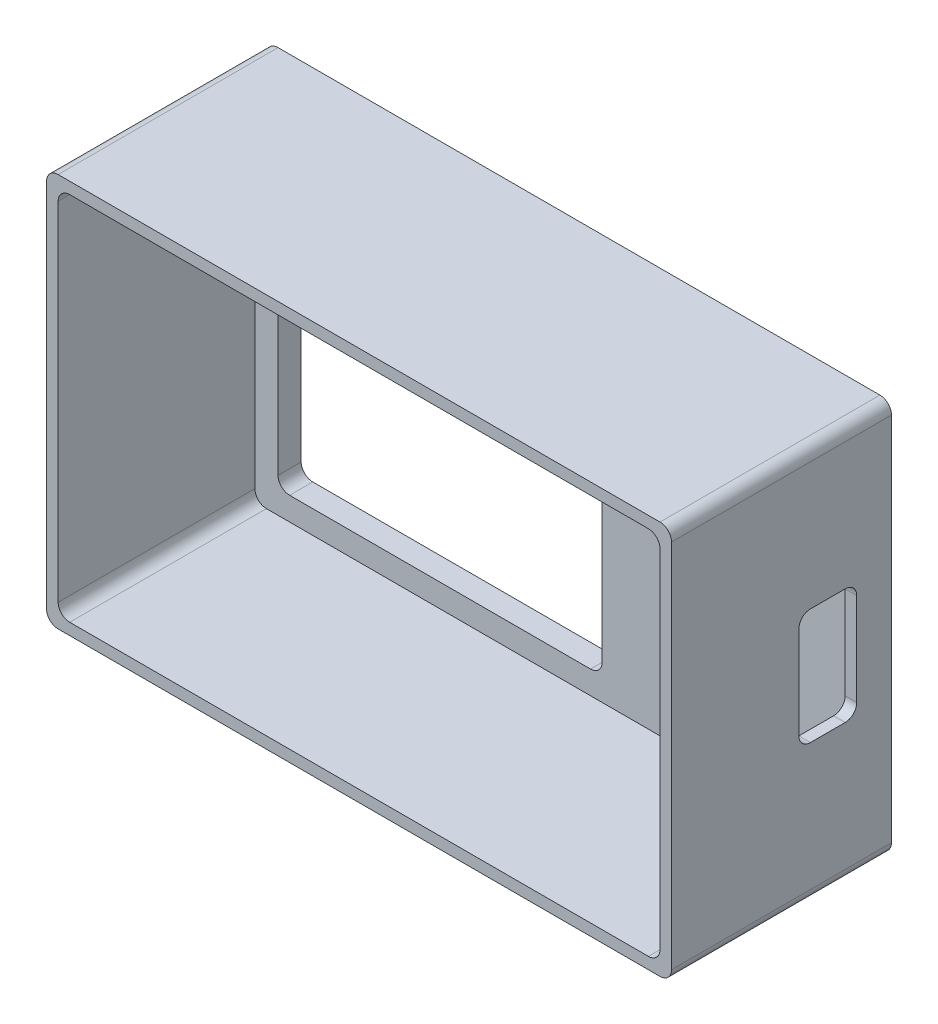
ISO-10303-21;
HEADER;
FILE_DESCRIPTION(('STEP AP214'),'2;1');
FILE_NAME('part.step','',(''),(''),'','','');
FILE_SCHEMA(('AUTOMOTIVE_DESIGN { 1 0 10303 214 1 1 1 1 }'));
ENDSEC;
DATA;
#1=APPLICATION_CONTEXT('core data for automotive mechanical design processes');
#2=APPLICATION_PROTOCOL_DEFINITION('international standard','automotive_design',2000,#1);
#3=PRODUCT_CONTEXT('',#1,'mechanical');
#4=PRODUCT('Part','Part','',(#3));
#5=PRODUCT_RELATED_PRODUCT_CATEGORY('part','',(#4));
#6=PRODUCT_DEFINITION_FORMATION('','',#4);
#7=PRODUCT_DEFINITION_CONTEXT('part definition',#1,'design');
#8=PRODUCT_DEFINITION('design','',#6,#7);
#9=PRODUCT_DEFINITION_SHAPE('','',#8);
#10=(LENGTH_UNIT() NAMED_UNIT(*) SI_UNIT(.MILLI.,.METRE.));
#11=(NAMED_UNIT(*) PLANE_ANGLE_UNIT() SI_UNIT($,.RADIAN.));
#12=(NAMED_UNIT(*) SI_UNIT($,.STERADIAN.) SOLID_ANGLE_UNIT());
#13=UNCERTAINTY_MEASURE_WITH_UNIT(LENGTH_MEASURE(1.E-05),#10,'distance_accuracy_value','');
#14=(GEOMETRIC_REPRESENTATION_CONTEXT(3) GLOBAL_UNCERTAINTY_ASSIGNED_CONTEXT((#13)) GLOBAL_UNIT_ASSIGNED_CONTEXT((#10,
#11,#12)) REPRESENTATION_CONTEXT('',''));
#15=CARTESIAN_POINT('',(0.,0.,0.));
#16=DIRECTION('',(0.,0.,1.));
#17=DIRECTION('',(1.,0.,0.));
#18=AXIS2_PLACEMENT_3D('',#15,#16,#17);
#19=CARTESIAN_POINT('',(0.,0.,2.));
#20=DIRECTION('',(0.,0.,1.));
#21=DIRECTION('',(1.,0.,0.));
#22=AXIS2_PLACEMENT_3D('',#19,#20,#21);
#23=PLANE('',#22);
#24=DIRECTION('',(-1.,0.,0.));
#25=VECTOR('',#24,1.);
#26=CARTESIAN_POINT('',(-24.,14.,2.));
#27=LINE('',#26,#25);
#28=CARTESIAN_POINT('',(2.99999999999999,14.,2.));
#29=VERTEX_POINT('',#28);
#30=CARTESIAN_POINT('',(-23.,14.,2.));
#31=VERTEX_POINT('',#30);
#32=EDGE_CURVE('E521',#29,#31,#27,.T.);
#33=ORIENTED_EDGE('',*,*,#32,.F.);
#34=CARTESIAN_POINT('',(3.,13.,2.));
#35=DIRECTION('',(0.,0.,1.));
#36=DIRECTION('',(1.,0.,0.));
#37=AXIS2_PLACEMENT_3D('',#34,#35,#36);
#38=CIRCLE('',#37,1.);
#39=CARTESIAN_POINT('',(4.,13.,2.));
#40=VERTEX_POINT('',#39);
#41=EDGE_CURVE('E493',#29,#40,#38,.F.);
#42=ORIENTED_EDGE('',*,*,#41,.T.);
#43=DIRECTION('',(0.,1.,0.));
#44=VECTOR('',#43,1.);
#45=CARTESIAN_POINT('',(4.,14.,2.));
#46=LINE('',#45,#44);
#47=CARTESIAN_POINT('',(4.,-13.,2.));
#48=VERTEX_POINT('',#47);
#49=EDGE_CURVE('E530',#48,#40,#46,.T.);
#50=ORIENTED_EDGE('',*,*,#49,.F.);
#51=CARTESIAN_POINT('',(3.,-13.,2.));
#52=DIRECTION('',(0.,0.,1.));
#53=DIRECTION('',(1.,0.,0.));
#54=AXIS2_PLACEMENT_3D('',#51,#52,#53);
#55=CIRCLE('',#54,1.);
#56=CARTESIAN_POINT('',(3.,-14.,2.));
#57=VERTEX_POINT('',#56);
#58=EDGE_CURVE('E488',#48,#57,#55,.F.);
#59=ORIENTED_EDGE('',*,*,#58,.T.);
#60=DIRECTION('',(1.,0.,0.));
#61=VECTOR('',#60,1.);
#62=CARTESIAN_POINT('',(-24.,-14.,2.));
#63=LINE('',#62,#61);
#64=CARTESIAN_POINT('',(-23.,-14.,2.));
#65=VERTEX_POINT('',#64);
#66=EDGE_CURVE('E535',#65,#57,#63,.T.);
#67=ORIENTED_EDGE('',*,*,#66,.F.);
#68=CARTESIAN_POINT('',(-23.,-13.,2.));
#69=DIRECTION('',(0.,0.,1.));
#70=DIRECTION('',(1.,0.,0.));
#71=AXIS2_PLACEMENT_3D('',#68,#69,#70);
#72=CIRCLE('',#71,1.);
#73=CARTESIAN_POINT('',(-24.,-13.,2.));
#74=VERTEX_POINT('',#73);
#75=EDGE_CURVE('E61',#65,#74,#72,.F.);
#76=ORIENTED_EDGE('',*,*,#75,.T.);
#77=DIRECTION('',(0.,-1.,0.));
#78=VECTOR('',#77,1.);
#79=CARTESIAN_POINT('',(-24.,14.,2.));
#80=LINE('',#79,#78);
#81=CARTESIAN_POINT('',(-24.,13.,2.));
#82=VERTEX_POINT('',#81);
#83=EDGE_CURVE('E523',#82,#74,#80,.T.);
#84=ORIENTED_EDGE('',*,*,#83,.F.);
#85=CARTESIAN_POINT('',(-23.,13.,2.));
#86=DIRECTION('',(0.,0.,1.));
#87=DIRECTION('',(1.,0.,0.));
#88=AXIS2_PLACEMENT_3D('',#85,#86,#87);
#89=CIRCLE('',#88,1.);
#90=EDGE_CURVE('E11',#82,#31,#89,.F.);
#91=ORIENTED_EDGE('',*,*,#90,.T.);
#92=EDGE_LOOP('',(#33,#42,#50,#59,#67,#76,#84,#91));
#93=FACE_BOUND('',#92,.T.);
#94=DIRECTION('',(0.,-1.,0.));
#95=VECTOR('',#94,1.);
#96=CARTESIAN_POINT('',(-26.,16.,2.));
#97=LINE('',#96,#95);
#98=CARTESIAN_POINT('',(-26.,15.,2.));
#99=VERTEX_POINT('',#98);
#100=CARTESIAN_POINT('',(-26.,-15.,2.));
#101=VERTEX_POINT('',#100);
#102=EDGE_CURVE('E265',#99,#101,#97,.T.);
#103=ORIENTED_EDGE('',*,*,#102,.T.);
#104=CARTESIAN_POINT('',(-25.,-15.,2.));
#105=DIRECTION('',(0.,0.,1.));
#106=DIRECTION('',(1.,0.,0.));
#107=AXIS2_PLACEMENT_3D('',#104,#105,#106);
#108=CIRCLE('',#107,1.);
#109=CARTESIAN_POINT('',(-25.,-16.,2.));
#110=VERTEX_POINT('',#109);
#111=EDGE_CURVE('E269',#101,#110,#108,.T.);
#112=ORIENTED_EDGE('',*,*,#111,.T.);
#113=DIRECTION('',(1.,0.,0.));
#114=VECTOR('',#113,1.);
#115=CARTESIAN_POINT('',(-26.,-16.,2.));
#116=LINE('',#115,#114);
#117=CARTESIAN_POINT('',(25.,-16.,2.));
#118=VERTEX_POINT('',#117);
#119=EDGE_CURVE('E284',#110,#118,#116,.T.);
#120=ORIENTED_EDGE('',*,*,#119,.T.);
#121=CARTESIAN_POINT('',(25.,-15.,2.));
#122=DIRECTION('',(0.,0.,1.));
#123=DIRECTION('',(1.,0.,0.));
#124=AXIS2_PLACEMENT_3D('',#121,#122,#123);
#125=CIRCLE('',#124,1.);
#126=CARTESIAN_POINT('',(26.,-15.,2.));
#127=VERTEX_POINT('',#126);
#128=EDGE_CURVE('E271',#118,#127,#125,.T.);
#129=ORIENTED_EDGE('',*,*,#128,.T.);
#130=DIRECTION('',(0.,1.,0.));
#131=VECTOR('',#130,1.);
#132=CARTESIAN_POINT('',(26.,16.,2.));
#133=LINE('',#132,#131);
#134=CARTESIAN_POINT('',(26.,15.,2.));
#135=VERTEX_POINT('',#134);
#136=EDGE_CURVE('E604',#127,#135,#133,.T.);
#137=ORIENTED_EDGE('',*,*,#136,.T.);
#138=CARTESIAN_POINT('',(25.,15.,2.));
#139=DIRECTION('',(0.,0.,1.));
#140=DIRECTION('',(1.,0.,0.));
#141=AXIS2_PLACEMENT_3D('',#138,#139,#140);
#142=CIRCLE('',#141,1.);
#143=CARTESIAN_POINT('',(25.,16.,2.));
#144=VERTEX_POINT('',#143);
#145=EDGE_CURVE('E294',#135,#144,#142,.T.);
#146=ORIENTED_EDGE('',*,*,#145,.T.);
#147=DIRECTION('',(-1.,0.,0.));
#148=VECTOR('',#147,1.);
#149=CARTESIAN_POINT('',(-26.,16.,2.));
#150=LINE('',#149,#148);
#151=CARTESIAN_POINT('',(-25.,16.,2.));
#152=VERTEX_POINT('',#151);
#153=EDGE_CURVE('E262',#144,#152,#150,.T.);
#154=ORIENTED_EDGE('',*,*,#153,.T.);
#155=CARTESIAN_POINT('',(-25.,15.,2.));
#156=DIRECTION('',(0.,0.,1.));
#157=DIRECTION('',(1.,0.,0.));
#158=AXIS2_PLACEMENT_3D('',#155,#156,#157);
#159=CIRCLE('',#158,1.);
#160=EDGE_CURVE('E257',#152,#99,#159,.T.);
#161=ORIENTED_EDGE('',*,*,#160,.T.);
#162=EDGE_LOOP('',(#103,#112,#120,#129,#137,#146,#154,#161));
#163=FACE_BOUND('',#162,.T.);
#164=ADVANCED_FACE('F47',(#93,#163),#23,.T.);
#165=CARTESIAN_POINT('',(0.,0.,0.));
#166=DIRECTION('',(0.,0.,1.));
#167=DIRECTION('',(1.,0.,0.));
#168=AXIS2_PLACEMENT_3D('',#165,#166,#167);
#169=PLANE('',#168);
#170=DIRECTION('',(0.,-1.,0.));
#171=VECTOR('',#170,1.);
#172=CARTESIAN_POINT('',(-27.,17.,0.));
#173=LINE('',#172,#171);
#174=CARTESIAN_POINT('',(-27.,16.,0.));
#175=VERTEX_POINT('',#174);
#176=CARTESIAN_POINT('',(-27.,-16.,0.));
#177=VERTEX_POINT('',#176);
#178=EDGE_CURVE('E297',#175,#177,#173,.T.);
#179=ORIENTED_EDGE('',*,*,#178,.F.);
#180=CARTESIAN_POINT('',(-26.,16.,0.));
#181=DIRECTION('',(0.,0.,1.));
#182=DIRECTION('',(1.,0.,0.));
#183=AXIS2_PLACEMENT_3D('',#180,#181,#182);
#184=CIRCLE('',#183,1.);
#185=CARTESIAN_POINT('',(-26.,17.,0.));
#186=VERTEX_POINT('',#185);
#187=EDGE_CURVE('E355',#175,#186,#184,.F.);
#188=ORIENTED_EDGE('',*,*,#187,.T.);
#189=DIRECTION('',(-1.,0.,0.));
#190=VECTOR('',#189,1.);
#191=CARTESIAN_POINT('',(-27.,17.,0.));
#192=LINE('',#191,#190);
#193=CARTESIAN_POINT('',(26.,17.,0.));
#194=VERTEX_POINT('',#193);
#195=EDGE_CURVE('E553',#194,#186,#192,.T.);
#196=ORIENTED_EDGE('',*,*,#195,.F.);
#197=CARTESIAN_POINT('',(26.,16.,0.));
#198=DIRECTION('',(0.,0.,1.));
#199=DIRECTION('',(1.,0.,0.));
#200=AXIS2_PLACEMENT_3D('',#197,#198,#199);
#201=CIRCLE('',#200,1.);
#202=CARTESIAN_POINT('',(27.,16.,0.));
#203=VERTEX_POINT('',#202);
#204=EDGE_CURVE('E342',#194,#203,#201,.F.);
#205=ORIENTED_EDGE('',*,*,#204,.T.);
#206=DIRECTION('',(0.,1.,0.));
#207=VECTOR('',#206,1.);
#208=CARTESIAN_POINT('',(27.,17.,0.));
#209=LINE('',#208,#207);
#210=CARTESIAN_POINT('',(27.,-16.,0.));
#211=VERTEX_POINT('',#210);
#212=EDGE_CURVE('E545',#211,#203,#209,.T.);
#213=ORIENTED_EDGE('',*,*,#212,.F.);
#214=CARTESIAN_POINT('',(26.,-16.,0.));
#215=DIRECTION('',(0.,0.,1.));
#216=DIRECTION('',(1.,0.,0.));
#217=AXIS2_PLACEMENT_3D('',#214,#215,#216);
#218=CIRCLE('',#217,1.);
#219=CARTESIAN_POINT('',(26.,-17.,0.));
#220=VERTEX_POINT('',#219);
#221=EDGE_CURVE('E346',#211,#220,#218,.F.);
#222=ORIENTED_EDGE('',*,*,#221,.T.);
#223=DIRECTION('',(1.,0.,0.));
#224=VECTOR('',#223,1.);
#225=CARTESIAN_POINT('',(-27.,-17.,0.));
#226=LINE('',#225,#224);
#227=CARTESIAN_POINT('',(-26.,-17.,0.));
#228=VERTEX_POINT('',#227);
#229=EDGE_CURVE('E290',#228,#220,#226,.T.);
#230=ORIENTED_EDGE('',*,*,#229,.F.);
#231=CARTESIAN_POINT('',(-26.,-16.,0.));
#232=DIRECTION('',(0.,0.,1.));
#233=DIRECTION('',(1.,0.,0.));
#234=AXIS2_PLACEMENT_3D('',#231,#232,#233);
#235=CIRCLE('',#234,1.);
#236=EDGE_CURVE('E353',#228,#177,#235,.F.);
#237=ORIENTED_EDGE('',*,*,#236,.T.);
#238=EDGE_LOOP('',(#179,#188,#196,#205,#213,#222,#230,#237));
#239=FACE_BOUND('',#238,.T.);
#240=DIRECTION('',(1.,0.,0.));
#241=VECTOR('',#240,1.);
#242=CARTESIAN_POINT('',(-24.,-14.,0.));
#243=LINE('',#242,#241);
#244=CARTESIAN_POINT('',(-23.,-14.,0.));
#245=VERTEX_POINT('',#244);
#246=CARTESIAN_POINT('',(3.,-14.,0.));
#247=VERTEX_POINT('',#246);
#248=EDGE_CURVE('E519',#245,#247,#243,.T.);
#249=ORIENTED_EDGE('',*,*,#248,.T.);
#250=CARTESIAN_POINT('',(3.,-13.,0.));
#251=DIRECTION('',(0.,0.,1.));
#252=DIRECTION('',(1.,0.,0.));
#253=AXIS2_PLACEMENT_3D('',#250,#251,#252);
#254=CIRCLE('',#253,1.);
#255=CARTESIAN_POINT('',(4.,-13.,0.));
#256=VERTEX_POINT('',#255);
#257=EDGE_CURVE('E484',#247,#256,#254,.T.);
#258=ORIENTED_EDGE('',*,*,#257,.T.);
#259=DIRECTION('',(0.,1.,0.));
#260=VECTOR('',#259,1.);
#261=CARTESIAN_POINT('',(4.,14.,0.));
#262=LINE('',#261,#260);
#263=CARTESIAN_POINT('',(4.,13.,0.));
#264=VERTEX_POINT('',#263);
#265=EDGE_CURVE('E543',#256,#264,#262,.T.);
#266=ORIENTED_EDGE('',*,*,#265,.T.);
#267=CARTESIAN_POINT('',(3.,13.,0.));
#268=DIRECTION('',(0.,0.,1.));
#269=DIRECTION('',(1.,0.,0.));
#270=AXIS2_PLACEMENT_3D('',#267,#268,#269);
#271=CIRCLE('',#270,1.);
#272=CARTESIAN_POINT('',(2.99999999999999,14.,0.));
#273=VERTEX_POINT('',#272);
#274=EDGE_CURVE('E491',#264,#273,#271,.T.);
#275=ORIENTED_EDGE('',*,*,#274,.T.);
#276=DIRECTION('',(-1.,0.,0.));
#277=VECTOR('',#276,1.);
#278=CARTESIAN_POINT('',(-24.,14.,0.));
#279=LINE('',#278,#277);
#280=CARTESIAN_POINT('',(-23.,14.,0.));
#281=VERTEX_POINT('',#280);
#282=EDGE_CURVE('E512',#273,#281,#279,.T.);
#283=ORIENTED_EDGE('',*,*,#282,.T.);
#284=CARTESIAN_POINT('',(-23.,13.,0.));
#285=DIRECTION('',(0.,0.,1.));
#286=DIRECTION('',(1.,0.,0.));
#287=AXIS2_PLACEMENT_3D('',#284,#285,#286);
#288=CIRCLE('',#287,1.);
#289=CARTESIAN_POINT('',(-24.,13.,0.));
#290=VERTEX_POINT('',#289);
#291=EDGE_CURVE('E59',#281,#290,#288,.T.);
#292=ORIENTED_EDGE('',*,*,#291,.T.);
#293=DIRECTION('',(0.,-1.,0.));
#294=VECTOR('',#293,1.);
#295=CARTESIAN_POINT('',(-24.,14.,0.));
#296=LINE('',#295,#294);
#297=CARTESIAN_POINT('',(-24.,-13.,0.));
#298=VERTEX_POINT('',#297);
#299=EDGE_CURVE('E508',#290,#298,#296,.T.);
#300=ORIENTED_EDGE('',*,*,#299,.T.);
#301=CARTESIAN_POINT('',(-23.,-13.,0.));
#302=DIRECTION('',(0.,0.,1.));
#303=DIRECTION('',(1.,0.,0.));
#304=AXIS2_PLACEMENT_3D('',#301,#302,#303);
#305=CIRCLE('',#304,1.);
#306=EDGE_CURVE('E500',#298,#245,#305,.T.);
#307=ORIENTED_EDGE('',*,*,#306,.T.);
#308=EDGE_LOOP('',(#249,#258,#266,#275,#283,#292,#300,#307));
#309=FACE_BOUND('',#308,.T.);
#310=ADVANCED_FACE('F510',(#239,#309),#169,.F.);
#311=CARTESIAN_POINT('',(27.,17.,2.));
#312=DIRECTION('',(-1.,0.,0.));
#313=DIRECTION('',(0.,0.,1.));
#314=AXIS2_PLACEMENT_3D('',#311,#312,#313);
#315=PLANE('',#314);
#316=DIRECTION('',(0.,0.,1.));
#317=VECTOR('',#316,1.);
#318=CARTESIAN_POINT('',(27.,5.,8.));
#319=LINE('',#318,#317);
#320=CARTESIAN_POINT('',(27.,5.,4.));
#321=VERTEX_POINT('',#320);
#322=CARTESIAN_POINT('',(27.,5.,7.));
#323=VERTEX_POINT('',#322);
#324=EDGE_CURVE('E630',#321,#323,#319,.T.);
#325=ORIENTED_EDGE('',*,*,#324,.F.);
#326=CARTESIAN_POINT('',(27.,4.,4.));
#327=DIRECTION('',(-1.,0.,0.));
#328=DIRECTION('',(0.,0.,1.));
#329=AXIS2_PLACEMENT_3D('',#326,#327,#328);
#330=CIRCLE('',#329,1.);
#331=CARTESIAN_POINT('',(27.,4.,3.));
#332=VERTEX_POINT('',#331);
#333=EDGE_CURVE('E432',#321,#332,#330,.T.);
#334=ORIENTED_EDGE('',*,*,#333,.T.);
#335=DIRECTION('',(0.,1.,0.));
#336=VECTOR('',#335,1.);
#337=CARTESIAN_POINT('',(27.,5.,3.));
#338=LINE('',#337,#336);
#339=CARTESIAN_POINT('',(27.,-4.,3.));
#340=VERTEX_POINT('',#339);
#341=EDGE_CURVE('E631',#340,#332,#338,.T.);
#342=ORIENTED_EDGE('',*,*,#341,.F.);
#343=CARTESIAN_POINT('',(27.,-4.,4.));
#344=DIRECTION('',(-1.,0.,0.));
#345=DIRECTION('',(0.,0.,1.));
#346=AXIS2_PLACEMENT_3D('',#343,#344,#345);
#347=CIRCLE('',#346,1.);
#348=CARTESIAN_POINT('',(27.,-5.,4.));
#349=VERTEX_POINT('',#348);
#350=EDGE_CURVE('E451',#340,#349,#347,.T.);
#351=ORIENTED_EDGE('',*,*,#350,.T.);
#352=DIRECTION('',(0.,0.,-1.));
#353=VECTOR('',#352,1.);
#354=CARTESIAN_POINT('',(27.,-5.,8.));
#355=LINE('',#354,#353);
#356=CARTESIAN_POINT('',(27.,-5.,7.));
#357=VERTEX_POINT('',#356);
#358=EDGE_CURVE('E606',#357,#349,#355,.T.);
#359=ORIENTED_EDGE('',*,*,#358,.F.);
#360=CARTESIAN_POINT('',(27.,-4.,7.));
#361=DIRECTION('',(-1.,0.,0.));
#362=DIRECTION('',(0.,0.,1.));
#363=AXIS2_PLACEMENT_3D('',#360,#361,#362);
#364=CIRCLE('',#363,1.);
#365=CARTESIAN_POINT('',(27.,-4.,8.));
#366=VERTEX_POINT('',#365);
#367=EDGE_CURVE('E448',#357,#366,#364,.T.);
#368=ORIENTED_EDGE('',*,*,#367,.T.);
#369=DIRECTION('',(0.,-1.,0.));
#370=VECTOR('',#369,1.);
#371=CARTESIAN_POINT('',(27.,5.,8.));
#372=LINE('',#371,#370);
#373=CARTESIAN_POINT('',(27.,4.,8.));
#374=VERTEX_POINT('',#373);
#375=EDGE_CURVE('E623',#374,#366,#372,.T.);
#376=ORIENTED_EDGE('',*,*,#375,.F.);
#377=CARTESIAN_POINT('',(27.,4.,7.));
#378=DIRECTION('',(-1.,0.,0.));
#379=DIRECTION('',(0.,0.,1.));
#380=AXIS2_PLACEMENT_3D('',#377,#378,#379);
#381=CIRCLE('',#380,1.);
#382=EDGE_CURVE('E439',#374,#323,#381,.T.);
#383=ORIENTED_EDGE('',*,*,#382,.T.);
#384=EDGE_LOOP('',(#325,#334,#342,#351,#359,#368,#376,#383));
#385=FACE_BOUND('',#384,.T.);
#386=DIRECTION('',(0.,1.,0.));
#387=VECTOR('',#386,1.);
#388=CARTESIAN_POINT('',(27.,17.,19.));
#389=LINE('',#388,#387);
#390=CARTESIAN_POINT('',(27.,-16.,19.));
#391=VERTEX_POINT('',#390);
#392=CARTESIAN_POINT('',(27.,16.,19.));
#393=VERTEX_POINT('',#392);
#394=EDGE_CURVE('E592',#391,#393,#389,.T.);
#395=ORIENTED_EDGE('',*,*,#394,.F.);
#396=DIRECTION('',(0.,0.,-1.));
#397=VECTOR('',#396,1.);
#398=CARTESIAN_POINT('',(27.,-16.,2.));
#399=LINE('',#398,#397);
#400=EDGE_CURVE('E387',#391,#211,#399,.T.);
#401=ORIENTED_EDGE('',*,*,#400,.T.);
#402=ORIENTED_EDGE('',*,*,#212,.T.);
#403=DIRECTION('',(0.,0.,-1.));
#404=VECTOR('',#403,1.);
#405=CARTESIAN_POINT('',(27.,16.,2.));
#406=LINE('',#405,#404);
#407=EDGE_CURVE('E382',#203,#393,#406,.F.);
#408=ORIENTED_EDGE('',*,*,#407,.T.);
#409=EDGE_LOOP('',(#395,#401,#402,#408));
#410=FACE_BOUND('',#409,.T.);
#411=ADVANCED_FACE('F677',(#385,#410),#315,.F.);
#412=CARTESIAN_POINT('',(-27.,17.,2.));
#413=DIRECTION('',(0.,-1.,0.));
#414=DIRECTION('',(0.,0.,-1.));
#415=AXIS2_PLACEMENT_3D('',#412,#413,#414);
#416=PLANE('',#415);
#417=ORIENTED_EDGE('',*,*,#195,.T.);
#418=DIRECTION('',(0.,0.,-1.));
#419=VECTOR('',#418,1.);
#420=CARTESIAN_POINT('',(-26.,17.,2.));
#421=LINE('',#420,#419);
#422=CARTESIAN_POINT('',(-26.,17.,19.));
#423=VERTEX_POINT('',#422);
#424=EDGE_CURVE('E363',#186,#423,#421,.F.);
#425=ORIENTED_EDGE('',*,*,#424,.T.);
#426=DIRECTION('',(-1.,0.,0.));
#427=VECTOR('',#426,1.);
#428=CARTESIAN_POINT('',(-27.,17.,19.));
#429=LINE('',#428,#427);
#430=CARTESIAN_POINT('',(26.,17.,19.));
#431=VERTEX_POINT('',#430);
#432=EDGE_CURVE('E589',#431,#423,#429,.T.);
#433=ORIENTED_EDGE('',*,*,#432,.F.);
#434=DIRECTION('',(0.,0.,-1.));
#435=VECTOR('',#434,1.);
#436=CARTESIAN_POINT('',(26.,17.,2.));
#437=LINE('',#436,#435);
#438=EDGE_CURVE('E356',#431,#194,#437,.T.);
#439=ORIENTED_EDGE('',*,*,#438,.T.);
#440=EDGE_LOOP('',(#417,#425,#433,#439));
#441=FACE_BOUND('',#440,.T.);
#442=ADVANCED_FACE('F679',(#441),#416,.F.);
#443=CARTESIAN_POINT('',(-27.,17.,2.));
#444=DIRECTION('',(1.,0.,0.));
#445=DIRECTION('',(0.,1.,0.));
#446=AXIS2_PLACEMENT_3D('',#443,#444,#445);
#447=PLANE('',#446);
#448=DIRECTION('',(0.,-1.,0.));
#449=VECTOR('',#448,1.);
#450=CARTESIAN_POINT('',(-27.,17.,19.));
#451=LINE('',#450,#449);
#452=CARTESIAN_POINT('',(-27.,16.,19.));
#453=VERTEX_POINT('',#452);
#454=CARTESIAN_POINT('',(-27.,-16.,19.));
#455=VERTEX_POINT('',#454);
#456=EDGE_CURVE('E583',#453,#455,#451,.T.);
#457=ORIENTED_EDGE('',*,*,#456,.F.);
#458=DIRECTION('',(0.,0.,-1.));
#459=VECTOR('',#458,1.);
#460=CARTESIAN_POINT('',(-27.,16.,2.));
#461=LINE('',#460,#459);
#462=EDGE_CURVE('E344',#453,#175,#461,.T.);
#463=ORIENTED_EDGE('',*,*,#462,.T.);
#464=ORIENTED_EDGE('',*,*,#178,.T.);
#465=DIRECTION('',(0.,0.,-1.));
#466=VECTOR('',#465,1.);
#467=CARTESIAN_POINT('',(-27.,-16.,2.));
#468=LINE('',#467,#466);
#469=EDGE_CURVE('E337',#177,#455,#468,.F.);
#470=ORIENTED_EDGE('',*,*,#469,.T.);
#471=EDGE_LOOP('',(#457,#463,#464,#470));
#472=FACE_BOUND('',#471,.T.);
#473=ADVANCED_FACE('F567',(#472),#447,.F.);
#474=CARTESIAN_POINT('',(-27.,-17.,2.));
#475=DIRECTION('',(0.,1.,0.));
#476=DIRECTION('',(0.,0.,1.));
#477=AXIS2_PLACEMENT_3D('',#474,#475,#476);
#478=PLANE('',#477);
#479=DIRECTION('',(1.,0.,0.));
#480=VECTOR('',#479,1.);
#481=CARTESIAN_POINT('',(-27.,-17.,19.));
#482=LINE('',#481,#480);
#483=CARTESIAN_POINT('',(-26.,-17.,19.));
#484=VERTEX_POINT('',#483);
#485=CARTESIAN_POINT('',(26.,-17.,19.));
#486=VERTEX_POINT('',#485);
#487=EDGE_CURVE('E550',#484,#486,#482,.T.);
#488=ORIENTED_EDGE('',*,*,#487,.F.);
#489=DIRECTION('',(0.,0.,-1.));
#490=VECTOR('',#489,1.);
#491=CARTESIAN_POINT('',(-26.,-17.,2.));
#492=LINE('',#491,#490);
#493=EDGE_CURVE('E377',#484,#228,#492,.T.);
#494=ORIENTED_EDGE('',*,*,#493,.T.);
#495=ORIENTED_EDGE('',*,*,#229,.T.);
#496=DIRECTION('',(0.,0.,-1.));
#497=VECTOR('',#496,1.);
#498=CARTESIAN_POINT('',(26.,-17.,2.));
#499=LINE('',#498,#497);
#500=EDGE_CURVE('E376',#220,#486,#499,.F.);
#501=ORIENTED_EDGE('',*,*,#500,.T.);
#502=EDGE_LOOP('',(#488,#494,#495,#501));
#503=FACE_BOUND('',#502,.T.);
#504=ADVANCED_FACE('F581',(#503),#478,.F.);
#505=CARTESIAN_POINT('',(4.,14.,2.));
#506=DIRECTION('',(-1.,0.,0.));
#507=DIRECTION('',(0.,-1.,0.));
#508=AXIS2_PLACEMENT_3D('',#505,#506,#507);
#509=PLANE('',#508);
#510=ORIENTED_EDGE('',*,*,#265,.F.);
#511=DIRECTION('',(0.,0.,-1.));
#512=VECTOR('',#511,1.);
#513=CARTESIAN_POINT('',(4.,-13.,2.));
#514=LINE('',#513,#512);
#515=EDGE_CURVE('E468',#256,#48,#514,.F.);
#516=ORIENTED_EDGE('',*,*,#515,.T.);
#517=ORIENTED_EDGE('',*,*,#49,.T.);
#518=DIRECTION('',(0.,0.,-1.));
#519=VECTOR('',#518,1.);
#520=CARTESIAN_POINT('',(4.,13.,0.));
#521=LINE('',#520,#519);
#522=EDGE_CURVE('E461',#40,#264,#521,.T.);
#523=ORIENTED_EDGE('',*,*,#522,.T.);
#524=EDGE_LOOP('',(#510,#516,#517,#523));
#525=FACE_BOUND('',#524,.T.);
#526=ADVANCED_FACE('F713',(#525),#509,.T.);
#527=CARTESIAN_POINT('',(-24.,14.,2.));
#528=DIRECTION('',(0.,-1.,0.));
#529=DIRECTION('',(0.,0.,-1.));
#530=AXIS2_PLACEMENT_3D('',#527,#528,#529);
#531=PLANE('',#530);
#532=ORIENTED_EDGE('',*,*,#282,.F.);
#533=DIRECTION('',(0.,0.,-1.));
#534=VECTOR('',#533,1.);
#535=CARTESIAN_POINT('',(3.,14.,2.));
#536=LINE('',#535,#534);
#537=EDGE_CURVE('E478',#273,#29,#536,.F.);
#538=ORIENTED_EDGE('',*,*,#537,.T.);
#539=ORIENTED_EDGE('',*,*,#32,.T.);
#540=DIRECTION('',(0.,0.,-1.));
#541=VECTOR('',#540,1.);
#542=CARTESIAN_POINT('',(-23.,14.,0.));
#543=LINE('',#542,#541);
#544=EDGE_CURVE('E472',#31,#281,#543,.T.);
#545=ORIENTED_EDGE('',*,*,#544,.T.);
#546=EDGE_LOOP('',(#532,#538,#539,#545));
#547=FACE_BOUND('',#546,.T.);
#548=ADVANCED_FACE('F528',(#547),#531,.T.);
#549=CARTESIAN_POINT('',(-24.,14.,2.));
#550=DIRECTION('',(1.,0.,0.));
#551=DIRECTION('',(0.,0.,-1.));
#552=AXIS2_PLACEMENT_3D('',#549,#550,#551);
#553=PLANE('',#552);
#554=ORIENTED_EDGE('',*,*,#83,.T.);
#555=DIRECTION('',(0.,0.,-1.));
#556=VECTOR('',#555,1.);
#557=CARTESIAN_POINT('',(-24.,-13.,0.));
#558=LINE('',#557,#556);
#559=EDGE_CURVE('E481',#74,#298,#558,.T.);
#560=ORIENTED_EDGE('',*,*,#559,.T.);
#561=ORIENTED_EDGE('',*,*,#299,.F.);
#562=DIRECTION('',(0.,0.,-1.));
#563=VECTOR('',#562,1.);
#564=CARTESIAN_POINT('',(-24.,13.,2.));
#565=LINE('',#564,#563);
#566=EDGE_CURVE('E75',#290,#82,#565,.F.);
#567=ORIENTED_EDGE('',*,*,#566,.T.);
#568=EDGE_LOOP('',(#554,#560,#561,#567));
#569=FACE_BOUND('',#568,.T.);
#570=ADVANCED_FACE('F514',(#569),#553,.T.);
#571=CARTESIAN_POINT('',(-24.,-14.,2.));
#572=DIRECTION('',(0.,1.,0.));
#573=DIRECTION('',(0.,0.,1.));
#574=AXIS2_PLACEMENT_3D('',#571,#572,#573);
#575=PLANE('',#574);
#576=ORIENTED_EDGE('',*,*,#66,.T.);
#577=DIRECTION('',(0.,0.,-1.));
#578=VECTOR('',#577,1.);
#579=CARTESIAN_POINT('',(3.,-14.,0.));
#580=LINE('',#579,#578);
#581=EDGE_CURVE('E463',#57,#247,#580,.T.);
#582=ORIENTED_EDGE('',*,*,#581,.T.);
#583=ORIENTED_EDGE('',*,*,#248,.F.);
#584=DIRECTION('',(0.,0.,-1.));
#585=VECTOR('',#584,1.);
#586=CARTESIAN_POINT('',(-23.,-14.,2.));
#587=LINE('',#586,#585);
#588=EDGE_CURVE('E456',#245,#65,#587,.F.);
#589=ORIENTED_EDGE('',*,*,#588,.T.);
#590=EDGE_LOOP('',(#576,#582,#583,#589));
#591=FACE_BOUND('',#590,.T.);
#592=ADVANCED_FACE('F752',(#591),#575,.T.);
#593=CARTESIAN_POINT('',(0.,0.,19.));
#594=DIRECTION('',(0.,0.,1.));
#595=DIRECTION('',(1.,0.,0.));
#596=AXIS2_PLACEMENT_3D('',#593,#594,#595);
#597=PLANE('',#596);
#598=ORIENTED_EDGE('',*,*,#432,.T.);
#599=CARTESIAN_POINT('',(-26.,16.,19.));
#600=DIRECTION('',(0.,0.,1.));
#601=DIRECTION('',(1.,0.,0.));
#602=AXIS2_PLACEMENT_3D('',#599,#600,#601);
#603=CIRCLE('',#602,1.);
#604=EDGE_CURVE('E373',#423,#453,#603,.T.);
#605=ORIENTED_EDGE('',*,*,#604,.T.);
#606=ORIENTED_EDGE('',*,*,#456,.T.);
#607=CARTESIAN_POINT('',(-26.,-16.,19.));
#608=DIRECTION('',(0.,0.,1.));
#609=DIRECTION('',(1.,0.,0.));
#610=AXIS2_PLACEMENT_3D('',#607,#608,#609);
#611=CIRCLE('',#610,1.);
#612=EDGE_CURVE('E367',#455,#484,#611,.T.);
#613=ORIENTED_EDGE('',*,*,#612,.T.);
#614=ORIENTED_EDGE('',*,*,#487,.T.);
#615=CARTESIAN_POINT('',(26.,-16.,19.));
#616=DIRECTION('',(0.,0.,1.));
#617=DIRECTION('',(1.,0.,0.));
#618=AXIS2_PLACEMENT_3D('',#615,#616,#617);
#619=CIRCLE('',#618,1.);
#620=EDGE_CURVE('E370',#486,#391,#619,.T.);
#621=ORIENTED_EDGE('',*,*,#620,.T.);
#622=ORIENTED_EDGE('',*,*,#394,.T.);
#623=CARTESIAN_POINT('',(26.,16.,19.));
#624=DIRECTION('',(0.,0.,1.));
#625=DIRECTION('',(1.,0.,0.));
#626=AXIS2_PLACEMENT_3D('',#623,#624,#625);
#627=CIRCLE('',#626,1.);
#628=EDGE_CURVE('E365',#393,#431,#627,.T.);
#629=ORIENTED_EDGE('',*,*,#628,.T.);
#630=EDGE_LOOP('',(#598,#605,#606,#613,#614,#621,#622,#629));
#631=FACE_BOUND('',#630,.T.);
#632=DIRECTION('',(-1.,0.,0.));
#633=VECTOR('',#632,1.);
#634=CARTESIAN_POINT('',(-26.,16.,19.));
#635=LINE('',#634,#633);
#636=CARTESIAN_POINT('',(25.,16.,19.));
#637=VERTEX_POINT('',#636);
#638=CARTESIAN_POINT('',(-25.,16.,19.));
#639=VERTEX_POINT('',#638);
#640=EDGE_CURVE('E611',#637,#639,#635,.T.);
#641=ORIENTED_EDGE('',*,*,#640,.F.);
#642=CARTESIAN_POINT('',(25.,15.,19.));
#643=DIRECTION('',(0.,0.,1.));
#644=DIRECTION('',(1.,0.,0.));
#645=AXIS2_PLACEMENT_3D('',#642,#643,#644);
#646=CIRCLE('',#645,1.);
#647=CARTESIAN_POINT('',(26.,15.,19.));
#648=VERTEX_POINT('',#647);
#649=EDGE_CURVE('E333',#637,#648,#646,.F.);
#650=ORIENTED_EDGE('',*,*,#649,.T.);
#651=DIRECTION('',(0.,1.,0.));
#652=VECTOR('',#651,1.);
#653=CARTESIAN_POINT('',(26.,16.,19.));
#654=LINE('',#653,#652);
#655=CARTESIAN_POINT('',(26.,-15.,19.));
#656=VERTEX_POINT('',#655);
#657=EDGE_CURVE('E601',#656,#648,#654,.T.);
#658=ORIENTED_EDGE('',*,*,#657,.F.);
#659=CARTESIAN_POINT('',(25.,-15.,19.));
#660=DIRECTION('',(0.,0.,1.));
#661=DIRECTION('',(1.,0.,0.));
#662=AXIS2_PLACEMENT_3D('',#659,#660,#661);
#663=CIRCLE('',#662,1.);
#664=CARTESIAN_POINT('',(25.,-16.,19.));
#665=VERTEX_POINT('',#664);
#666=EDGE_CURVE('E335',#656,#665,#663,.F.);
#667=ORIENTED_EDGE('',*,*,#666,.T.);
#668=DIRECTION('',(1.,0.,0.));
#669=VECTOR('',#668,1.);
#670=CARTESIAN_POINT('',(-26.,-16.,19.));
#671=LINE('',#670,#669);
#672=CARTESIAN_POINT('',(-25.,-16.,19.));
#673=VERTEX_POINT('',#672);
#674=EDGE_CURVE('E598',#673,#665,#671,.T.);
#675=ORIENTED_EDGE('',*,*,#674,.F.);
#676=CARTESIAN_POINT('',(-25.,-15.,19.));
#677=DIRECTION('',(0.,0.,1.));
#678=DIRECTION('',(1.,0.,0.));
#679=AXIS2_PLACEMENT_3D('',#676,#677,#678);
#680=CIRCLE('',#679,1.);
#681=CARTESIAN_POINT('',(-26.,-15.,19.));
#682=VERTEX_POINT('',#681);
#683=EDGE_CURVE('E330',#673,#682,#680,.F.);
#684=ORIENTED_EDGE('',*,*,#683,.T.);
#685=DIRECTION('',(0.,-1.,0.));
#686=VECTOR('',#685,1.);
#687=CARTESIAN_POINT('',(-26.,16.,19.));
#688=LINE('',#687,#686);
#689=CARTESIAN_POINT('',(-26.,15.,19.));
#690=VERTEX_POINT('',#689);
#691=EDGE_CURVE('E612',#690,#682,#688,.T.);
#692=ORIENTED_EDGE('',*,*,#691,.F.);
#693=CARTESIAN_POINT('',(-25.,15.,19.));
#694=DIRECTION('',(0.,0.,1.));
#695=DIRECTION('',(1.,0.,0.));
#696=AXIS2_PLACEMENT_3D('',#693,#694,#695);
#697=CIRCLE('',#696,1.);
#698=EDGE_CURVE('E289',#690,#639,#697,.F.);
#699=ORIENTED_EDGE('',*,*,#698,.T.);
#700=EDGE_LOOP('',(#641,#650,#658,#667,#675,#684,#692,#699));
#701=FACE_BOUND('',#700,.T.);
#702=ADVANCED_FACE('F580',(#631,#701),#597,.T.);
#703=CARTESIAN_POINT('',(26.,16.,19.));
#704=DIRECTION('',(-1.,0.,0.));
#705=DIRECTION('',(0.,-1.,0.));
#706=AXIS2_PLACEMENT_3D('',#703,#704,#705);
#707=PLANE('',#706);
#708=DIRECTION('',(0.,-1.,0.));
#709=VECTOR('',#708,1.);
#710=CARTESIAN_POINT('',(26.,16.,3.00000000000001));
#711=LINE('',#710,#709);
#712=CARTESIAN_POINT('',(26.,4.,3.));
#713=VERTEX_POINT('',#712);
#714=CARTESIAN_POINT('',(26.,-4.,3.));
#715=VERTEX_POINT('',#714);
#716=EDGE_CURVE('E405',#713,#715,#711,.T.);
#717=ORIENTED_EDGE('',*,*,#716,.F.);
#718=CARTESIAN_POINT('',(26.,4.,4.));
#719=DIRECTION('',(-1.,0.,0.));
#720=DIRECTION('',(0.,-1.,0.));
#721=AXIS2_PLACEMENT_3D('',#718,#719,#720);
#722=CIRCLE('',#721,1.);
#723=CARTESIAN_POINT('',(26.,5.,4.));
#724=VERTEX_POINT('',#723);
#725=EDGE_CURVE('E440',#713,#724,#722,.F.);
#726=ORIENTED_EDGE('',*,*,#725,.T.);
#727=DIRECTION('',(0.,0.,-1.));
#728=VECTOR('',#727,1.);
#729=CARTESIAN_POINT('',(26.,5.,19.));
#730=LINE('',#729,#728);
#731=CARTESIAN_POINT('',(26.,5.,7.));
#732=VERTEX_POINT('',#731);
#733=EDGE_CURVE('E388',#732,#724,#730,.T.);
#734=ORIENTED_EDGE('',*,*,#733,.F.);
#735=CARTESIAN_POINT('',(26.,4.,7.));
#736=DIRECTION('',(-1.,0.,0.));
#737=DIRECTION('',(0.,-1.,0.));
#738=AXIS2_PLACEMENT_3D('',#735,#736,#737);
#739=CIRCLE('',#738,1.);
#740=CARTESIAN_POINT('',(26.,4.,8.));
#741=VERTEX_POINT('',#740);
#742=EDGE_CURVE('E444',#732,#741,#739,.F.);
#743=ORIENTED_EDGE('',*,*,#742,.T.);
#744=DIRECTION('',(0.,1.,0.));
#745=VECTOR('',#744,1.);
#746=CARTESIAN_POINT('',(26.,16.,8.00000000000001));
#747=LINE('',#746,#745);
#748=CARTESIAN_POINT('',(26.,-4.,8.));
#749=VERTEX_POINT('',#748);
#750=EDGE_CURVE('E395',#749,#741,#747,.T.);
#751=ORIENTED_EDGE('',*,*,#750,.F.);
#752=CARTESIAN_POINT('',(26.,-4.,7.));
#753=DIRECTION('',(-1.,0.,0.));
#754=DIRECTION('',(0.,-1.,0.));
#755=AXIS2_PLACEMENT_3D('',#752,#753,#754);
#756=CIRCLE('',#755,1.);
#757=CARTESIAN_POINT('',(26.,-5.,7.));
#758=VERTEX_POINT('',#757);
#759=EDGE_CURVE('E450',#749,#758,#756,.F.);
#760=ORIENTED_EDGE('',*,*,#759,.T.);
#761=DIRECTION('',(0.,0.,1.));
#762=VECTOR('',#761,1.);
#763=CARTESIAN_POINT('',(26.,-5.,19.));
#764=LINE('',#763,#762);
#765=CARTESIAN_POINT('',(26.,-5.,4.));
#766=VERTEX_POINT('',#765);
#767=EDGE_CURVE('E400',#766,#758,#764,.T.);
#768=ORIENTED_EDGE('',*,*,#767,.F.);
#769=CARTESIAN_POINT('',(26.,-4.,4.));
#770=DIRECTION('',(-1.,0.,0.));
#771=DIRECTION('',(0.,-1.,0.));
#772=AXIS2_PLACEMENT_3D('',#769,#770,#771);
#773=CIRCLE('',#772,1.);
#774=EDGE_CURVE('E452',#766,#715,#773,.F.);
#775=ORIENTED_EDGE('',*,*,#774,.T.);
#776=EDGE_LOOP('',(#717,#726,#734,#743,#751,#760,#768,#775));
#777=FACE_BOUND('',#776,.T.);
#778=ORIENTED_EDGE('',*,*,#136,.F.);
#779=DIRECTION('',(0.,0.,-1.));
#780=VECTOR('',#779,1.);
#781=CARTESIAN_POINT('',(26.,-15.,19.));
#782=LINE('',#781,#780);
#783=EDGE_CURVE('E322',#127,#656,#782,.F.);
#784=ORIENTED_EDGE('',*,*,#783,.T.);
#785=ORIENTED_EDGE('',*,*,#657,.T.);
#786=DIRECTION('',(0.,0.,-1.));
#787=VECTOR('',#786,1.);
#788=CARTESIAN_POINT('',(26.,15.,2.));
#789=LINE('',#788,#787);
#790=EDGE_CURVE('E321',#648,#135,#789,.T.);
#791=ORIENTED_EDGE('',*,*,#790,.T.);
#792=EDGE_LOOP('',(#778,#784,#785,#791));
#793=FACE_BOUND('',#792,.T.);
#794=ADVANCED_FACE('F647',(#777,#793),#707,.T.);
#795=CARTESIAN_POINT('',(-26.,16.,19.));
#796=DIRECTION('',(0.,-1.,0.));
#797=DIRECTION('',(0.,0.,-1.));
#798=AXIS2_PLACEMENT_3D('',#795,#796,#797);
#799=PLANE('',#798);
#800=ORIENTED_EDGE('',*,*,#640,.T.);
#801=DIRECTION('',(0.,0.,-1.));
#802=VECTOR('',#801,1.);
#803=CARTESIAN_POINT('',(-25.,16.,2.));
#804=LINE('',#803,#802);
#805=EDGE_CURVE('E318',#639,#152,#804,.T.);
#806=ORIENTED_EDGE('',*,*,#805,.T.);
#807=ORIENTED_EDGE('',*,*,#153,.F.);
#808=DIRECTION('',(0.,0.,-1.));
#809=VECTOR('',#808,1.);
#810=CARTESIAN_POINT('',(25.,16.,19.));
#811=LINE('',#810,#809);
#812=EDGE_CURVE('E312',#144,#637,#811,.F.);
#813=ORIENTED_EDGE('',*,*,#812,.T.);
#814=EDGE_LOOP('',(#800,#806,#807,#813));
#815=FACE_BOUND('',#814,.T.);
#816=ADVANCED_FACE('F742',(#815),#799,.T.);
#817=CARTESIAN_POINT('',(-26.,16.,19.));
#818=DIRECTION('',(1.,0.,0.));
#819=DIRECTION('',(0.,1.,0.));
#820=AXIS2_PLACEMENT_3D('',#817,#818,#819);
#821=PLANE('',#820);
#822=ORIENTED_EDGE('',*,*,#691,.T.);
#823=DIRECTION('',(0.,0.,-1.));
#824=VECTOR('',#823,1.);
#825=CARTESIAN_POINT('',(-26.,-15.,2.));
#826=LINE('',#825,#824);
#827=EDGE_CURVE('E278',#682,#101,#826,.T.);
#828=ORIENTED_EDGE('',*,*,#827,.T.);
#829=ORIENTED_EDGE('',*,*,#102,.F.);
#830=DIRECTION('',(0.,0.,-1.));
#831=VECTOR('',#830,1.);
#832=CARTESIAN_POINT('',(-26.,15.,19.));
#833=LINE('',#832,#831);
#834=EDGE_CURVE('E280',#99,#690,#833,.F.);
#835=ORIENTED_EDGE('',*,*,#834,.T.);
#836=EDGE_LOOP('',(#822,#828,#829,#835));
#837=FACE_BOUND('',#836,.T.);
#838=ADVANCED_FACE('F277',(#837),#821,.T.);
#839=CARTESIAN_POINT('',(-26.,-16.,19.));
#840=DIRECTION('',(0.,1.,0.));
#841=DIRECTION('',(0.,0.,1.));
#842=AXIS2_PLACEMENT_3D('',#839,#840,#841);
#843=PLANE('',#842);
#844=ORIENTED_EDGE('',*,*,#119,.F.);
#845=DIRECTION('',(0.,0.,-1.));
#846=VECTOR('',#845,1.);
#847=CARTESIAN_POINT('',(-25.,-16.,19.));
#848=LINE('',#847,#846);
#849=EDGE_CURVE('E315',#110,#673,#848,.F.);
#850=ORIENTED_EDGE('',*,*,#849,.T.);
#851=ORIENTED_EDGE('',*,*,#674,.T.);
#852=DIRECTION('',(0.,0.,-1.));
#853=VECTOR('',#852,1.);
#854=CARTESIAN_POINT('',(25.,-16.,2.));
#855=LINE('',#854,#853);
#856=EDGE_CURVE('E306',#665,#118,#855,.T.);
#857=ORIENTED_EDGE('',*,*,#856,.T.);
#858=EDGE_LOOP('',(#844,#850,#851,#857));
#859=FACE_BOUND('',#858,.T.);
#860=ADVANCED_FACE('F729',(#859),#843,.T.);
#861=CARTESIAN_POINT('',(-25.,-15.,19.));
#862=DIRECTION('',(0.,0.,1.));
#863=DIRECTION('',(1.,0.,0.));
#864=AXIS2_PLACEMENT_3D('',#861,#862,#863);
#865=CYLINDRICAL_SURFACE('',#864,1.);
#866=ORIENTED_EDGE('',*,*,#683,.F.);
#867=ORIENTED_EDGE('',*,*,#849,.F.);
#868=ORIENTED_EDGE('',*,*,#111,.F.);
#869=ORIENTED_EDGE('',*,*,#827,.F.);
#870=EDGE_LOOP('',(#866,#867,#868,#869));
#871=FACE_BOUND('',#870,.T.);
#872=ADVANCED_FACE('F722',(#871),#865,.F.);
#873=CARTESIAN_POINT('',(-25.,15.,19.));
#874=DIRECTION('',(0.,0.,1.));
#875=DIRECTION('',(1.,0.,0.));
#876=AXIS2_PLACEMENT_3D('',#873,#874,#875);
#877=CYLINDRICAL_SURFACE('',#876,1.);
#878=ORIENTED_EDGE('',*,*,#698,.F.);
#879=ORIENTED_EDGE('',*,*,#834,.F.);
#880=ORIENTED_EDGE('',*,*,#160,.F.);
#881=ORIENTED_EDGE('',*,*,#805,.F.);
#882=EDGE_LOOP('',(#878,#879,#880,#881));
#883=FACE_BOUND('',#882,.T.);
#884=ADVANCED_FACE('F281',(#883),#877,.F.);
#885=CARTESIAN_POINT('',(25.,-15.,19.));
#886=DIRECTION('',(0.,0.,1.));
#887=DIRECTION('',(1.,0.,0.));
#888=AXIS2_PLACEMENT_3D('',#885,#886,#887);
#889=CYLINDRICAL_SURFACE('',#888,1.);
#890=ORIENTED_EDGE('',*,*,#666,.F.);
#891=ORIENTED_EDGE('',*,*,#783,.F.);
#892=ORIENTED_EDGE('',*,*,#128,.F.);
#893=ORIENTED_EDGE('',*,*,#856,.F.);
#894=EDGE_LOOP('',(#890,#891,#892,#893));
#895=FACE_BOUND('',#894,.T.);
#896=ADVANCED_FACE('F704',(#895),#889,.F.);
#897=CARTESIAN_POINT('',(25.,15.,19.));
#898=DIRECTION('',(0.,0.,1.));
#899=DIRECTION('',(1.,0.,0.));
#900=AXIS2_PLACEMENT_3D('',#897,#898,#899);
#901=CYLINDRICAL_SURFACE('',#900,1.);
#902=ORIENTED_EDGE('',*,*,#649,.F.);
#903=ORIENTED_EDGE('',*,*,#812,.F.);
#904=ORIENTED_EDGE('',*,*,#145,.F.);
#905=ORIENTED_EDGE('',*,*,#790,.F.);
#906=EDGE_LOOP('',(#902,#903,#904,#905));
#907=FACE_BOUND('',#906,.T.);
#908=ADVANCED_FACE('F699',(#907),#901,.F.);
#909=CARTESIAN_POINT('',(-26.,16.,2.));
#910=DIRECTION('',(0.,0.,-1.));
#911=DIRECTION('',(-1.,0.,0.));
#912=AXIS2_PLACEMENT_3D('',#909,#910,#911);
#913=CYLINDRICAL_SURFACE('',#912,1.);
#914=ORIENTED_EDGE('',*,*,#604,.F.);
#915=ORIENTED_EDGE('',*,*,#424,.F.);
#916=ORIENTED_EDGE('',*,*,#187,.F.);
#917=ORIENTED_EDGE('',*,*,#462,.F.);
#918=EDGE_LOOP('',(#914,#915,#916,#917));
#919=FACE_BOUND('',#918,.T.);
#920=ADVANCED_FACE('F700',(#919),#913,.T.);
#921=CARTESIAN_POINT('',(-26.,-16.,2.));
#922=DIRECTION('',(0.,0.,-1.));
#923=DIRECTION('',(-1.,0.,0.));
#924=AXIS2_PLACEMENT_3D('',#921,#922,#923);
#925=CYLINDRICAL_SURFACE('',#924,1.);
#926=ORIENTED_EDGE('',*,*,#612,.F.);
#927=ORIENTED_EDGE('',*,*,#469,.F.);
#928=ORIENTED_EDGE('',*,*,#236,.F.);
#929=ORIENTED_EDGE('',*,*,#493,.F.);
#930=EDGE_LOOP('',(#926,#927,#928,#929));
#931=FACE_BOUND('',#930,.T.);
#932=ADVANCED_FACE('F574',(#931),#925,.T.);
#933=CARTESIAN_POINT('',(26.,-16.,2.));
#934=DIRECTION('',(0.,0.,-1.));
#935=DIRECTION('',(-1.,0.,0.));
#936=AXIS2_PLACEMENT_3D('',#933,#934,#935);
#937=CYLINDRICAL_SURFACE('',#936,1.);
#938=ORIENTED_EDGE('',*,*,#620,.F.);
#939=ORIENTED_EDGE('',*,*,#500,.F.);
#940=ORIENTED_EDGE('',*,*,#221,.F.);
#941=ORIENTED_EDGE('',*,*,#400,.F.);
#942=EDGE_LOOP('',(#938,#939,#940,#941));
#943=FACE_BOUND('',#942,.T.);
#944=ADVANCED_FACE('F686',(#943),#937,.T.);
#945=CARTESIAN_POINT('',(26.,16.,2.));
#946=DIRECTION('',(0.,0.,-1.));
#947=DIRECTION('',(-1.,0.,0.));
#948=AXIS2_PLACEMENT_3D('',#945,#946,#947);
#949=CYLINDRICAL_SURFACE('',#948,1.);
#950=ORIENTED_EDGE('',*,*,#628,.F.);
#951=ORIENTED_EDGE('',*,*,#407,.F.);
#952=ORIENTED_EDGE('',*,*,#204,.F.);
#953=ORIENTED_EDGE('',*,*,#438,.F.);
#954=EDGE_LOOP('',(#950,#951,#952,#953));
#955=FACE_BOUND('',#954,.T.);
#956=ADVANCED_FACE('F687',(#955),#949,.T.);
#957=CARTESIAN_POINT('',(10.,5.,3.));
#958=DIRECTION('',(0.,0.,-1.));
#959=DIRECTION('',(0.,1.,0.));
#960=AXIS2_PLACEMENT_3D('',#957,#958,#959);
#961=PLANE('',#960);
#962=ORIENTED_EDGE('',*,*,#341,.T.);
#963=DIRECTION('',(1.,0.,0.));
#964=VECTOR('',#963,1.);
#965=CARTESIAN_POINT('',(26.,4.,3.));
#966=LINE('',#965,#964);
#967=EDGE_CURVE('E417',#332,#713,#966,.F.);
#968=ORIENTED_EDGE('',*,*,#967,.T.);
#969=ORIENTED_EDGE('',*,*,#716,.T.);
#970=DIRECTION('',(1.,0.,0.));
#971=VECTOR('',#970,1.);
#972=CARTESIAN_POINT('',(27.,-4.,3.));
#973=LINE('',#972,#971);
#974=EDGE_CURVE('E415',#715,#340,#973,.T.);
#975=ORIENTED_EDGE('',*,*,#974,.T.);
#976=EDGE_LOOP('',(#962,#968,#969,#975));
#977=FACE_BOUND('',#976,.T.);
#978=ADVANCED_FACE('F640',(#977),#961,.F.);
#979=CARTESIAN_POINT('',(10.,-5.,8.));
#980=DIRECTION('',(0.,-1.,0.));
#981=DIRECTION('',(0.,0.,-1.));
#982=AXIS2_PLACEMENT_3D('',#979,#980,#981);
#983=PLANE('',#982);
#984=ORIENTED_EDGE('',*,*,#767,.T.);
#985=DIRECTION('',(1.,0.,0.));
#986=VECTOR('',#985,1.);
#987=CARTESIAN_POINT('',(27.,-5.,7.));
#988=LINE('',#987,#986);
#989=EDGE_CURVE('E429',#758,#357,#988,.T.);
#990=ORIENTED_EDGE('',*,*,#989,.T.);
#991=ORIENTED_EDGE('',*,*,#358,.T.);
#992=DIRECTION('',(1.,0.,0.));
#993=VECTOR('',#992,1.);
#994=CARTESIAN_POINT('',(26.,-5.,4.));
#995=LINE('',#994,#993);
#996=EDGE_CURVE('E430',#349,#766,#995,.F.);
#997=ORIENTED_EDGE('',*,*,#996,.T.);
#998=EDGE_LOOP('',(#984,#990,#991,#997));
#999=FACE_BOUND('',#998,.T.);
#1000=ADVANCED_FACE('F674',(#999),#983,.F.);
#1001=CARTESIAN_POINT('',(10.,5.,8.));
#1002=DIRECTION('',(0.,0.,1.));
#1003=DIRECTION('',(0.,-1.,0.));
#1004=AXIS2_PLACEMENT_3D('',#1001,#1002,#1003);
#1005=PLANE('',#1004);
#1006=ORIENTED_EDGE('',*,*,#750,.T.);
#1007=DIRECTION('',(1.,0.,0.));
#1008=VECTOR('',#1007,1.);
#1009=CARTESIAN_POINT('',(27.,4.,8.));
#1010=LINE('',#1009,#1008);
#1011=EDGE_CURVE('E421',#741,#374,#1010,.T.);
#1012=ORIENTED_EDGE('',*,*,#1011,.T.);
#1013=ORIENTED_EDGE('',*,*,#375,.T.);
#1014=DIRECTION('',(1.,0.,0.));
#1015=VECTOR('',#1014,1.);
#1016=CARTESIAN_POINT('',(26.,-4.,8.));
#1017=LINE('',#1016,#1015);
#1018=EDGE_CURVE('E419',#366,#749,#1017,.F.);
#1019=ORIENTED_EDGE('',*,*,#1018,.T.);
#1020=EDGE_LOOP('',(#1006,#1012,#1013,#1019));
#1021=FACE_BOUND('',#1020,.T.);
#1022=ADVANCED_FACE('F665',(#1021),#1005,.F.);
#1023=CARTESIAN_POINT('',(10.,5.,8.));
#1024=DIRECTION('',(0.,1.,0.));
#1025=DIRECTION('',(0.,0.,1.));
#1026=AXIS2_PLACEMENT_3D('',#1023,#1024,#1025);
#1027=PLANE('',#1026);
#1028=ORIENTED_EDGE('',*,*,#733,.T.);
#1029=DIRECTION('',(1.,0.,0.));
#1030=VECTOR('',#1029,1.);
#1031=CARTESIAN_POINT('',(27.,5.,4.));
#1032=LINE('',#1031,#1030);
#1033=EDGE_CURVE('E410',#724,#321,#1032,.T.);
#1034=ORIENTED_EDGE('',*,*,#1033,.T.);
#1035=ORIENTED_EDGE('',*,*,#324,.T.);
#1036=DIRECTION('',(1.,0.,0.));
#1037=VECTOR('',#1036,1.);
#1038=CARTESIAN_POINT('',(26.,5.,7.));
#1039=LINE('',#1038,#1037);
#1040=EDGE_CURVE('E408',#323,#732,#1039,.F.);
#1041=ORIENTED_EDGE('',*,*,#1040,.T.);
#1042=EDGE_LOOP('',(#1028,#1034,#1035,#1041));
#1043=FACE_BOUND('',#1042,.T.);
#1044=ADVANCED_FACE('F653',(#1043),#1027,.F.);
#1045=CARTESIAN_POINT('',(10.,4.,4.));
#1046=DIRECTION('',(-1.,0.,0.));
#1047=DIRECTION('',(0.,0.,1.));
#1048=AXIS2_PLACEMENT_3D('',#1045,#1046,#1047);
#1049=CYLINDRICAL_SURFACE('',#1048,1.);
#1050=ORIENTED_EDGE('',*,*,#725,.F.);
#1051=ORIENTED_EDGE('',*,*,#967,.F.);
#1052=ORIENTED_EDGE('',*,*,#333,.F.);
#1053=ORIENTED_EDGE('',*,*,#1033,.F.);
#1054=EDGE_LOOP('',(#1050,#1051,#1052,#1053));
#1055=FACE_BOUND('',#1054,.T.);
#1056=ADVANCED_FACE('F642',(#1055),#1049,.F.);
#1057=CARTESIAN_POINT('',(10.,4.,7.));
#1058=DIRECTION('',(-1.,0.,0.));
#1059=DIRECTION('',(0.,0.,1.));
#1060=AXIS2_PLACEMENT_3D('',#1057,#1058,#1059);
#1061=CYLINDRICAL_SURFACE('',#1060,1.);
#1062=ORIENTED_EDGE('',*,*,#742,.F.);
#1063=ORIENTED_EDGE('',*,*,#1040,.F.);
#1064=ORIENTED_EDGE('',*,*,#382,.F.);
#1065=ORIENTED_EDGE('',*,*,#1011,.F.);
#1066=EDGE_LOOP('',(#1062,#1063,#1064,#1065));
#1067=FACE_BOUND('',#1066,.T.);
#1068=ADVANCED_FACE('F660',(#1067),#1061,.F.);
#1069=CARTESIAN_POINT('',(10.,-4.,7.));
#1070=DIRECTION('',(-1.,0.,0.));
#1071=DIRECTION('',(0.,0.,1.));
#1072=AXIS2_PLACEMENT_3D('',#1069,#1070,#1071);
#1073=CYLINDRICAL_SURFACE('',#1072,1.);
#1074=ORIENTED_EDGE('',*,*,#759,.F.);
#1075=ORIENTED_EDGE('',*,*,#1018,.F.);
#1076=ORIENTED_EDGE('',*,*,#367,.F.);
#1077=ORIENTED_EDGE('',*,*,#989,.F.);
#1078=EDGE_LOOP('',(#1074,#1075,#1076,#1077));
#1079=FACE_BOUND('',#1078,.T.);
#1080=ADVANCED_FACE('F668',(#1079),#1073,.F.);
#1081=CARTESIAN_POINT('',(10.,-4.,4.));
#1082=DIRECTION('',(-1.,0.,0.));
#1083=DIRECTION('',(0.,0.,1.));
#1084=AXIS2_PLACEMENT_3D('',#1081,#1082,#1083);
#1085=CYLINDRICAL_SURFACE('',#1084,1.);
#1086=ORIENTED_EDGE('',*,*,#774,.F.);
#1087=ORIENTED_EDGE('',*,*,#996,.F.);
#1088=ORIENTED_EDGE('',*,*,#350,.F.);
#1089=ORIENTED_EDGE('',*,*,#974,.F.);
#1090=EDGE_LOOP('',(#1086,#1087,#1088,#1089));
#1091=FACE_BOUND('',#1090,.T.);
#1092=ADVANCED_FACE('F672',(#1091),#1085,.F.);
#1093=CARTESIAN_POINT('',(3.,-13.,2.));
#1094=DIRECTION('',(0.,0.,1.));
#1095=DIRECTION('',(1.,0.,0.));
#1096=AXIS2_PLACEMENT_3D('',#1093,#1094,#1095);
#1097=CYLINDRICAL_SURFACE('',#1096,1.);
#1098=ORIENTED_EDGE('',*,*,#58,.F.);
#1099=ORIENTED_EDGE('',*,*,#515,.F.);
#1100=ORIENTED_EDGE('',*,*,#257,.F.);
#1101=ORIENTED_EDGE('',*,*,#581,.F.);
#1102=EDGE_LOOP('',(#1098,#1099,#1100,#1101));
#1103=FACE_BOUND('',#1102,.T.);
#1104=ADVANCED_FACE('F771',(#1103),#1097,.F.);
#1105=CARTESIAN_POINT('',(3.,13.,2.));
#1106=DIRECTION('',(0.,0.,1.));
#1107=DIRECTION('',(1.,0.,0.));
#1108=AXIS2_PLACEMENT_3D('',#1105,#1106,#1107);
#1109=CYLINDRICAL_SURFACE('',#1108,1.);
#1110=ORIENTED_EDGE('',*,*,#41,.F.);
#1111=ORIENTED_EDGE('',*,*,#537,.F.);
#1112=ORIENTED_EDGE('',*,*,#274,.F.);
#1113=ORIENTED_EDGE('',*,*,#522,.F.);
#1114=EDGE_LOOP('',(#1110,#1111,#1112,#1113));
#1115=FACE_BOUND('',#1114,.T.);
#1116=ADVANCED_FACE('F784',(#1115),#1109,.F.);
#1117=CARTESIAN_POINT('',(-23.,-13.,2.));
#1118=DIRECTION('',(0.,0.,1.));
#1119=DIRECTION('',(1.,0.,0.));
#1120=AXIS2_PLACEMENT_3D('',#1117,#1118,#1119);
#1121=CYLINDRICAL_SURFACE('',#1120,1.);
#1122=ORIENTED_EDGE('',*,*,#75,.F.);
#1123=ORIENTED_EDGE('',*,*,#588,.F.);
#1124=ORIENTED_EDGE('',*,*,#306,.F.);
#1125=ORIENTED_EDGE('',*,*,#559,.F.);
#1126=EDGE_LOOP('',(#1122,#1123,#1124,#1125));
#1127=FACE_BOUND('',#1126,.T.);
#1128=ADVANCED_FACE('F780',(#1127),#1121,.F.);
#1129=CARTESIAN_POINT('',(-23.,13.,2.));
#1130=DIRECTION('',(0.,0.,1.));
#1131=DIRECTION('',(1.,0.,0.));
#1132=AXIS2_PLACEMENT_3D('',#1129,#1130,#1131);
#1133=CYLINDRICAL_SURFACE('',#1132,1.);
#1134=ORIENTED_EDGE('',*,*,#90,.F.);
#1135=ORIENTED_EDGE('',*,*,#566,.F.);
#1136=ORIENTED_EDGE('',*,*,#291,.F.);
#1137=ORIENTED_EDGE('',*,*,#544,.F.);
#1138=EDGE_LOOP('',(#1134,#1135,#1136,#1137));
#1139=FACE_BOUND('',#1138,.T.);
#1140=ADVANCED_FACE('F51',(#1139),#1133,.F.);
#1141=CLOSED_SHELL('',(#164,#310,#411,#442,#473,#504,#526,#548,#570,#592,#702,#794,#816,#838,
#860,#872,#884,#896,#908,#920,#932,#944,#956,#978,#1000,#1022,#1044,#1056,#1068,#1080,#1092,
#1104,#1116,#1128,#1140));
#1142=MANIFOLD_SOLID_BREP('B2',#1141);
#1143=ADVANCED_BREP_SHAPE_REPRESENTATION('',(#18,#1142),#14);
#1144=SHAPE_DEFINITION_REPRESENTATION(#9,#1143);
ENDSEC;
END-ISO-10303-21;
